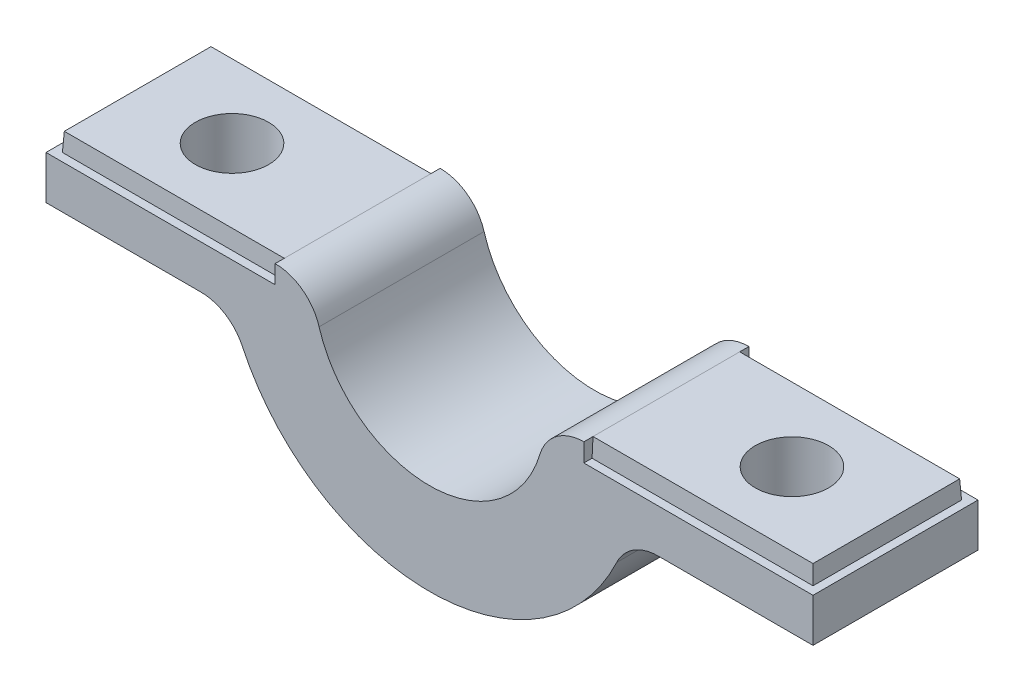
ISO-10303-21;
HEADER;
FILE_DESCRIPTION(('STEP AP214'),'2;1');
FILE_NAME('part.step','',(''),(''),'','','');
FILE_SCHEMA(('AUTOMOTIVE_DESIGN { 1 0 10303 214 1 1 1 1 }'));
ENDSEC;
DATA;
#1=APPLICATION_CONTEXT('core data for automotive mechanical design processes');
#2=APPLICATION_PROTOCOL_DEFINITION('international standard','automotive_design',2000,#1);
#3=PRODUCT_CONTEXT('',#1,'mechanical');
#4=PRODUCT('Part','Part','',(#3));
#5=PRODUCT_RELATED_PRODUCT_CATEGORY('part','',(#4));
#6=PRODUCT_DEFINITION_FORMATION('','',#4);
#7=PRODUCT_DEFINITION_CONTEXT('part definition',#1,'design');
#8=PRODUCT_DEFINITION('design','',#6,#7);
#9=PRODUCT_DEFINITION_SHAPE('','',#8);
#10=(LENGTH_UNIT() NAMED_UNIT(*) SI_UNIT(.MILLI.,.METRE.));
#11=(NAMED_UNIT(*) PLANE_ANGLE_UNIT() SI_UNIT($,.RADIAN.));
#12=(NAMED_UNIT(*) SI_UNIT($,.STERADIAN.) SOLID_ANGLE_UNIT());
#13=UNCERTAINTY_MEASURE_WITH_UNIT(LENGTH_MEASURE(1.E-05),#10,'distance_accuracy_value','');
#14=(GEOMETRIC_REPRESENTATION_CONTEXT(3) GLOBAL_UNCERTAINTY_ASSIGNED_CONTEXT((#13)) GLOBAL_UNIT_ASSIGNED_CONTEXT((#10,
#11,#12)) REPRESENTATION_CONTEXT('',''));
#15=CARTESIAN_POINT('',(0.,0.,0.));
#16=DIRECTION('',(0.,0.,1.));
#17=DIRECTION('',(1.,0.,0.));
#18=AXIS2_PLACEMENT_3D('',#15,#16,#17);
#19=CARTESIAN_POINT('',(0.,0.,0.));
#20=DIRECTION('',(0.,0.,1.));
#21=DIRECTION('',(1.,0.,0.));
#22=AXIS2_PLACEMENT_3D('',#19,#20,#21);
#23=PLANE('',#22);
#24=DIRECTION('',(0.,-1.,0.));
#25=VECTOR('',#24,1.);
#26=CARTESIAN_POINT('',(47.9639122544113,-2.,0.));
#27=LINE('',#26,#25);
#28=CARTESIAN_POINT('',(47.9639122544113,0.,0.));
#29=VERTEX_POINT('',#28);
#30=CARTESIAN_POINT('',(47.9639122544113,-2.,0.));
#31=VERTEX_POINT('',#30);
#32=EDGE_CURVE('E205',#29,#31,#27,.T.);
#33=ORIENTED_EDGE('',*,*,#32,.T.);
#34=DIRECTION('',(-1.,0.,0.));
#35=VECTOR('',#34,1.);
#36=CARTESIAN_POINT('',(-10.7127398951121,-2.,0.));
#37=LINE('',#36,#35);
#38=CARTESIAN_POINT('',(72.9639122544113,-2.,0.));
#39=VERTEX_POINT('',#38);
#40=EDGE_CURVE('E215',#39,#31,#37,.T.);
#41=ORIENTED_EDGE('',*,*,#40,.F.);
#42=DIRECTION('',(0.,-1.,0.));
#43=VECTOR('',#42,1.);
#44=CARTESIAN_POINT('',(72.9639122544113,0.,0.));
#45=LINE('',#44,#43);
#46=CARTESIAN_POINT('',(72.9639122544113,-6.73489423689242,0.));
#47=VERTEX_POINT('',#46);
#48=EDGE_CURVE('E308',#39,#47,#45,.T.);
#49=ORIENTED_EDGE('',*,*,#48,.T.);
#50=DIRECTION('',(1.,0.,0.));
#51=VECTOR('',#50,1.);
#52=CARTESIAN_POINT('',(0.,-6.73489423689242,0.));
#53=LINE('',#52,#51);
#54=CARTESIAN_POINT('',(56.0679493846258,-6.73489423689242,0.));
#55=VERTEX_POINT('',#54);
#56=EDGE_CURVE('E354',#55,#47,#53,.T.);
#57=ORIENTED_EDGE('',*,*,#56,.F.);
#58=CARTESIAN_POINT('',(56.0679493846258,-11.7348942368924,0.));
#59=DIRECTION('',(0.,0.,1.));
#60=DIRECTION('',(1.,0.,0.));
#61=AXIS2_PLACEMENT_3D('',#58,#59,#60);
#62=CIRCLE('',#61,5.);
#63=CARTESIAN_POINT('',(51.543668012419,-9.60630830602131,0.));
#64=VERTEX_POINT('',#63);
#65=EDGE_CURVE('E351',#55,#64,#62,.T.);
#66=ORIENTED_EDGE('',*,*,#65,.T.);
#67=CARTESIAN_POINT('',(31.1255861796496,0.,0.));
#68=DIRECTION('',(0.,0.,1.));
#69=DIRECTION('',(1.,0.,0.));
#70=AXIS2_PLACEMENT_3D('',#67,#68,#69);
#71=CIRCLE('',#70,22.565);
#72=CARTESIAN_POINT('',(10.7102960062231,-9.61223970439748,0.));
#73=VERTEX_POINT('',#72);
#74=EDGE_CURVE('E348',#73,#64,#71,.T.);
#75=ORIENTED_EDGE('',*,*,#74,.F.);
#76=CARTESIAN_POINT('',(6.18663321574527,-11.742139926954,0.));
#77=DIRECTION('',(0.,0.,1.));
#78=DIRECTION('',(1.,0.,0.));
#79=AXIS2_PLACEMENT_3D('',#76,#77,#78);
#80=CIRCLE('',#79,5.);
#81=CARTESIAN_POINT('',(6.18663321574527,-6.74213992695399,0.));
#82=VERTEX_POINT('',#81);
#83=EDGE_CURVE('E345',#73,#82,#80,.T.);
#84=ORIENTED_EDGE('',*,*,#83,.T.);
#85=DIRECTION('',(-1.,0.,0.));
#86=VECTOR('',#85,1.);
#87=CARTESIAN_POINT('',(0.,-6.74213992695399,0.));
#88=LINE('',#87,#86);
#89=CARTESIAN_POINT('',(-10.7127398951121,-6.74213992695399,0.));
#90=VERTEX_POINT('',#89);
#91=EDGE_CURVE('E342',#82,#90,#88,.T.);
#92=ORIENTED_EDGE('',*,*,#91,.T.);
#93=DIRECTION('',(0.,-1.,0.));
#94=VECTOR('',#93,1.);
#95=CARTESIAN_POINT('',(-10.7127398951121,0.,0.));
#96=LINE('',#95,#94);
#97=CARTESIAN_POINT('',(-10.7127398951121,-2.,0.));
#98=VERTEX_POINT('',#97);
#99=EDGE_CURVE('E340',#98,#90,#96,.T.);
#100=ORIENTED_EDGE('',*,*,#99,.F.);
#101=DIRECTION('',(-1.,0.,0.));
#102=VECTOR('',#101,1.);
#103=CARTESIAN_POINT('',(-10.7127398951121,-2.,0.));
#104=LINE('',#103,#102);
#105=CARTESIAN_POINT('',(14.2872601048879,-2.,0.));
#106=VERTEX_POINT('',#105);
#107=EDGE_CURVE('E266',#106,#98,#104,.T.);
#108=ORIENTED_EDGE('',*,*,#107,.F.);
#109=DIRECTION('',(0.,-1.,0.));
#110=VECTOR('',#109,1.);
#111=CARTESIAN_POINT('',(14.2872601048879,-2.,0.));
#112=LINE('',#111,#110);
#113=CARTESIAN_POINT('',(14.2872601048879,0.,0.));
#114=VERTEX_POINT('',#113);
#115=EDGE_CURVE('E264',#114,#106,#112,.T.);
#116=ORIENTED_EDGE('',*,*,#115,.F.);
#117=CARTESIAN_POINT('',(14.2872601048879,-5.,0.));
#118=DIRECTION('',(0.,0.,1.));
#119=DIRECTION('',(1.,0.,0.));
#120=AXIS2_PLACEMENT_3D('',#117,#118,#119);
#121=CIRCLE('',#120,5.);
#122=CARTESIAN_POINT('',(19.0804072938323,-3.57671505835468,0.));
#123=VERTEX_POINT('',#122);
#124=EDGE_CURVE('E303',#114,#123,#121,.F.);
#125=ORIENTED_EDGE('',*,*,#124,.T.);
#126=CARTESIAN_POINT('',(31.1255861796496,0.,0.));
#127=DIRECTION('',(0.,0.,1.));
#128=DIRECTION('',(1.,0.,0.));
#129=AXIS2_PLACEMENT_3D('',#126,#127,#128);
#130=CIRCLE('',#129,12.565);
#131=CARTESIAN_POINT('',(43.1707650654669,-3.57671505835468,0.));
#132=VERTEX_POINT('',#131);
#133=EDGE_CURVE('E337',#123,#132,#130,.T.);
#134=ORIENTED_EDGE('',*,*,#133,.T.);
#135=CARTESIAN_POINT('',(47.9639122544113,-5.,0.));
#136=DIRECTION('',(0.,0.,1.));
#137=DIRECTION('',(1.,0.,0.));
#138=AXIS2_PLACEMENT_3D('',#135,#136,#137);
#139=CIRCLE('',#138,5.);
#140=EDGE_CURVE('E334',#29,#132,#139,.T.);
#141=ORIENTED_EDGE('',*,*,#140,.F.);
#142=EDGE_LOOP('',(#33,#41,#49,#57,#66,#75,#84,#92,#100,#108,#116,#125,#134,#141));
#143=FACE_BOUND('',#142,.T.);
#144=ADVANCED_FACE('F41',(#143),#23,.F.);
#145=CARTESIAN_POINT('',(0.,0.,18.));
#146=DIRECTION('',(0.,0.,1.));
#147=DIRECTION('',(1.,0.,0.));
#148=AXIS2_PLACEMENT_3D('',#145,#146,#147);
#149=PLANE('',#148);
#150=DIRECTION('',(-1.,0.,0.));
#151=VECTOR('',#150,1.);
#152=CARTESIAN_POINT('',(-10.7127398951121,-2.,18.));
#153=LINE('',#152,#151);
#154=CARTESIAN_POINT('',(72.9639122544113,-2.,18.));
#155=VERTEX_POINT('',#154);
#156=CARTESIAN_POINT('',(47.9639122544113,-2.,18.));
#157=VERTEX_POINT('',#156);
#158=EDGE_CURVE('E57',#155,#157,#153,.T.);
#159=ORIENTED_EDGE('',*,*,#158,.T.);
#160=DIRECTION('',(0.,-1.,0.));
#161=VECTOR('',#160,1.);
#162=CARTESIAN_POINT('',(47.9639122544113,-2.,18.));
#163=LINE('',#162,#161);
#164=CARTESIAN_POINT('',(47.9639122544113,0.,18.));
#165=VERTEX_POINT('',#164);
#166=EDGE_CURVE('E237',#165,#157,#163,.T.);
#167=ORIENTED_EDGE('',*,*,#166,.F.);
#168=CARTESIAN_POINT('',(47.9639122544113,-5.,18.));
#169=DIRECTION('',(0.,0.,1.));
#170=DIRECTION('',(1.,0.,0.));
#171=AXIS2_PLACEMENT_3D('',#168,#169,#170);
#172=CIRCLE('',#171,5.);
#173=CARTESIAN_POINT('',(43.1707650654669,-3.57671505835468,18.));
#174=VERTEX_POINT('',#173);
#175=EDGE_CURVE('E307',#165,#174,#172,.T.);
#176=ORIENTED_EDGE('',*,*,#175,.T.);
#177=CARTESIAN_POINT('',(31.1255861796496,0.,18.));
#178=DIRECTION('',(0.,0.,1.));
#179=DIRECTION('',(1.,0.,0.));
#180=AXIS2_PLACEMENT_3D('',#177,#178,#179);
#181=CIRCLE('',#180,12.565);
#182=CARTESIAN_POINT('',(19.0804072938323,-3.57671505835468,18.));
#183=VERTEX_POINT('',#182);
#184=EDGE_CURVE('E310',#183,#174,#181,.T.);
#185=ORIENTED_EDGE('',*,*,#184,.F.);
#186=CARTESIAN_POINT('',(14.2872601048879,-5.,18.));
#187=DIRECTION('',(0.,0.,1.));
#188=DIRECTION('',(1.,0.,0.));
#189=AXIS2_PLACEMENT_3D('',#186,#187,#188);
#190=CIRCLE('',#189,5.);
#191=CARTESIAN_POINT('',(14.2872601048879,0.,18.));
#192=VERTEX_POINT('',#191);
#193=EDGE_CURVE('E304',#192,#183,#190,.F.);
#194=ORIENTED_EDGE('',*,*,#193,.F.);
#195=DIRECTION('',(0.,-1.,0.));
#196=VECTOR('',#195,1.);
#197=CARTESIAN_POINT('',(14.2872601048879,-2.,18.));
#198=LINE('',#197,#196);
#199=CARTESIAN_POINT('',(14.2872601048879,-2.,18.));
#200=VERTEX_POINT('',#199);
#201=EDGE_CURVE('E64',#192,#200,#198,.T.);
#202=ORIENTED_EDGE('',*,*,#201,.T.);
#203=DIRECTION('',(-1.,0.,0.));
#204=VECTOR('',#203,1.);
#205=CARTESIAN_POINT('',(-10.7127398951121,-2.,18.));
#206=LINE('',#205,#204);
#207=CARTESIAN_POINT('',(-10.7127398951121,-2.,18.));
#208=VERTEX_POINT('',#207);
#209=EDGE_CURVE('E260',#200,#208,#206,.T.);
#210=ORIENTED_EDGE('',*,*,#209,.T.);
#211=DIRECTION('',(0.,-1.,0.));
#212=VECTOR('',#211,1.);
#213=CARTESIAN_POINT('',(-10.7127398951121,0.,18.));
#214=LINE('',#213,#212);
#215=CARTESIAN_POINT('',(-10.7127398951121,-6.74213992695399,18.));
#216=VERTEX_POINT('',#215);
#217=EDGE_CURVE('E313',#208,#216,#214,.T.);
#218=ORIENTED_EDGE('',*,*,#217,.T.);
#219=DIRECTION('',(-1.,0.,0.));
#220=VECTOR('',#219,1.);
#221=CARTESIAN_POINT('',(0.,-6.74213992695399,18.));
#222=LINE('',#221,#220);
#223=CARTESIAN_POINT('',(6.18663321574527,-6.74213992695399,18.));
#224=VERTEX_POINT('',#223);
#225=EDGE_CURVE('E315',#224,#216,#222,.T.);
#226=ORIENTED_EDGE('',*,*,#225,.F.);
#227=CARTESIAN_POINT('',(6.18663321574527,-11.742139926954,18.));
#228=DIRECTION('',(0.,0.,1.));
#229=DIRECTION('',(1.,0.,0.));
#230=AXIS2_PLACEMENT_3D('',#227,#228,#229);
#231=CIRCLE('',#230,5.);
#232=CARTESIAN_POINT('',(10.7102960062231,-9.61223970439748,18.));
#233=VERTEX_POINT('',#232);
#234=EDGE_CURVE('E318',#233,#224,#231,.T.);
#235=ORIENTED_EDGE('',*,*,#234,.F.);
#236=CARTESIAN_POINT('',(31.1255861796496,0.,18.));
#237=DIRECTION('',(0.,0.,1.));
#238=DIRECTION('',(1.,0.,0.));
#239=AXIS2_PLACEMENT_3D('',#236,#237,#238);
#240=CIRCLE('',#239,22.565);
#241=CARTESIAN_POINT('',(51.543668012419,-9.60630830602131,18.));
#242=VERTEX_POINT('',#241);
#243=EDGE_CURVE('E321',#233,#242,#240,.T.);
#244=ORIENTED_EDGE('',*,*,#243,.T.);
#245=CARTESIAN_POINT('',(56.0679493846258,-11.7348942368924,18.));
#246=DIRECTION('',(0.,0.,1.));
#247=DIRECTION('',(1.,0.,0.));
#248=AXIS2_PLACEMENT_3D('',#245,#246,#247);
#249=CIRCLE('',#248,5.);
#250=CARTESIAN_POINT('',(56.0679493846258,-6.73489423689242,18.));
#251=VERTEX_POINT('',#250);
#252=EDGE_CURVE('E323',#251,#242,#249,.T.);
#253=ORIENTED_EDGE('',*,*,#252,.F.);
#254=DIRECTION('',(1.,0.,0.));
#255=VECTOR('',#254,1.);
#256=CARTESIAN_POINT('',(0.,-6.73489423689242,18.));
#257=LINE('',#256,#255);
#258=CARTESIAN_POINT('',(72.9639122544113,-6.73489423689242,18.));
#259=VERTEX_POINT('',#258);
#260=EDGE_CURVE('E326',#251,#259,#257,.T.);
#261=ORIENTED_EDGE('',*,*,#260,.T.);
#262=DIRECTION('',(0.,-1.,0.));
#263=VECTOR('',#262,1.);
#264=CARTESIAN_POINT('',(72.9639122544113,0.,18.));
#265=LINE('',#264,#263);
#266=EDGE_CURVE('E329',#155,#259,#265,.T.);
#267=ORIENTED_EDGE('',*,*,#266,.F.);
#268=EDGE_LOOP('',(#159,#167,#176,#185,#194,#202,#210,#218,#226,#235,#244,#253,#261,#267));
#269=FACE_BOUND('',#268,.T.);
#270=ADVANCED_FACE('F398',(#269),#149,.T.);
#271=CARTESIAN_POINT('',(-10.7127398951121,0.,-0.00999999999999959));
#272=DIRECTION('',(0.,-1.,0.));
#273=DIRECTION('',(0.,0.,-1.));
#274=AXIS2_PLACEMENT_3D('',#271,#272,#273);
#275=PLANE('',#274);
#276=CARTESIAN_POINT('',(61.6725531764272,0.,9.00473748766582));
#277=DIRECTION('',(0.,-1.,0.));
#278=DIRECTION('',(0.,0.,-1.));
#279=AXIS2_PLACEMENT_3D('',#276,#277,#278);
#280=CIRCLE('',#279,4.00000000000001);
#281=CARTESIAN_POINT('',(61.6725531764272,0.,5.0047374876658));
#282=VERTEX_POINT('',#281);
#283=EDGE_CURVE('E300',#282,#282,#280,.T.);
#284=ORIENTED_EDGE('',*,*,#283,.T.);
#285=EDGE_LOOP('',(#284));
#286=FACE_BOUND('',#285,.T.);
#287=DIRECTION('',(0.,0.,-1.));
#288=VECTOR('',#287,1.);
#289=CARTESIAN_POINT('',(71.9639122544113,0.,-0.00999999999999959));
#290=LINE('',#289,#288);
#291=CARTESIAN_POINT('',(71.9639122544113,0.,17.));
#292=VERTEX_POINT('',#291);
#293=CARTESIAN_POINT('',(71.9639122544113,0.,1.));
#294=VERTEX_POINT('',#293);
#295=EDGE_CURVE('E241',#292,#294,#290,.T.);
#296=ORIENTED_EDGE('',*,*,#295,.T.);
#297=DIRECTION('',(1.,0.,0.));
#298=VECTOR('',#297,1.);
#299=CARTESIAN_POINT('',(-10.7127398951121,0.,1.));
#300=LINE('',#299,#298);
#301=CARTESIAN_POINT('',(47.9639122544113,0.,1.));
#302=VERTEX_POINT('',#301);
#303=EDGE_CURVE('E216',#302,#294,#300,.T.);
#304=ORIENTED_EDGE('',*,*,#303,.F.);
#305=DIRECTION('',(0.,0.,-1.));
#306=VECTOR('',#305,1.);
#307=CARTESIAN_POINT('',(47.9639122544113,0.,18.));
#308=LINE('',#307,#306);
#309=CARTESIAN_POINT('',(47.9639122544113,0.,17.));
#310=VERTEX_POINT('',#309);
#311=EDGE_CURVE('E376',#310,#302,#308,.T.);
#312=ORIENTED_EDGE('',*,*,#311,.F.);
#313=DIRECTION('',(1.,0.,0.));
#314=VECTOR('',#313,1.);
#315=CARTESIAN_POINT('',(-10.7127398951121,0.,17.));
#316=LINE('',#315,#314);
#317=EDGE_CURVE('E242',#310,#292,#316,.T.);
#318=ORIENTED_EDGE('',*,*,#317,.T.);
#319=EDGE_LOOP('',(#296,#304,#312,#318));
#320=FACE_BOUND('',#319,.T.);
#321=ADVANCED_FACE('F43',(#286,#320),#275,.F.);
#322=CARTESIAN_POINT('',(0.580014645169769,0.,9.));
#323=DIRECTION('',(0.,-1.,0.));
#324=DIRECTION('',(0.,0.,-1.));
#325=AXIS2_PLACEMENT_3D('',#322,#323,#324);
#326=CIRCLE('',#325,4.);
#327=CARTESIAN_POINT('',(0.580014645169769,0.,5.));
#328=VERTEX_POINT('',#327);
#329=EDGE_CURVE('E297',#328,#328,#326,.T.);
#330=ORIENTED_EDGE('',*,*,#329,.T.);
#331=EDGE_LOOP('',(#330));
#332=FACE_BOUND('',#331,.T.);
#333=DIRECTION('',(0.,0.,-1.));
#334=VECTOR('',#333,1.);
#335=CARTESIAN_POINT('',(14.2872601048879,0.,18.));
#336=LINE('',#335,#334);
#337=CARTESIAN_POINT('',(14.2872601048879,0.,17.));
#338=VERTEX_POINT('',#337);
#339=CARTESIAN_POINT('',(14.2872601048879,0.,1.));
#340=VERTEX_POINT('',#339);
#341=EDGE_CURVE('E50',#338,#340,#336,.T.);
#342=ORIENTED_EDGE('',*,*,#341,.T.);
#343=DIRECTION('',(1.,0.,0.));
#344=VECTOR('',#343,1.);
#345=CARTESIAN_POINT('',(-10.7127398951121,0.,1.));
#346=LINE('',#345,#344);
#347=CARTESIAN_POINT('',(-9.71273989511209,0.,1.));
#348=VERTEX_POINT('',#347);
#349=EDGE_CURVE('E279',#348,#340,#346,.T.);
#350=ORIENTED_EDGE('',*,*,#349,.F.);
#351=DIRECTION('',(0.,0.,-1.));
#352=VECTOR('',#351,1.);
#353=CARTESIAN_POINT('',(-9.71273989511209,0.,-0.00999999999999959));
#354=LINE('',#353,#352);
#355=CARTESIAN_POINT('',(-9.71273989511209,0.,17.));
#356=VERTEX_POINT('',#355);
#357=EDGE_CURVE('E275',#356,#348,#354,.T.);
#358=ORIENTED_EDGE('',*,*,#357,.F.);
#359=DIRECTION('',(1.,0.,0.));
#360=VECTOR('',#359,1.);
#361=CARTESIAN_POINT('',(-10.7127398951121,0.,17.));
#362=LINE('',#361,#360);
#363=EDGE_CURVE('E263',#356,#338,#362,.T.);
#364=ORIENTED_EDGE('',*,*,#363,.T.);
#365=EDGE_LOOP('',(#342,#350,#358,#364));
#366=FACE_BOUND('',#365,.T.);
#367=ADVANCED_FACE('F412',(#332,#366),#275,.F.);
#368=CARTESIAN_POINT('',(56.0679493846258,-11.7348942368924,18.));
#369=DIRECTION('',(0.,0.,-1.));
#370=DIRECTION('',(-1.,0.,0.));
#371=AXIS2_PLACEMENT_3D('',#368,#369,#370);
#372=CYLINDRICAL_SURFACE('',#371,5.);
#373=ORIENTED_EDGE('',*,*,#65,.F.);
#374=DIRECTION('',(0.,0.,-1.));
#375=VECTOR('',#374,1.);
#376=CARTESIAN_POINT('',(56.0679493846258,-6.73489423689242,18.));
#377=LINE('',#376,#375);
#378=EDGE_CURVE('E361',#251,#55,#377,.T.);
#379=ORIENTED_EDGE('',*,*,#378,.F.);
#380=ORIENTED_EDGE('',*,*,#252,.T.);
#381=DIRECTION('',(0.,0.,-1.));
#382=VECTOR('',#381,1.);
#383=CARTESIAN_POINT('',(51.543668012419,-9.60630830602131,18.));
#384=LINE('',#383,#382);
#385=EDGE_CURVE('E364',#242,#64,#384,.T.);
#386=ORIENTED_EDGE('',*,*,#385,.T.);
#387=EDGE_LOOP('',(#373,#379,#380,#386));
#388=FACE_BOUND('',#387,.T.);
#389=ADVANCED_FACE('F419',(#388),#372,.F.);
#390=CARTESIAN_POINT('',(31.1255861796496,0.,18.));
#391=DIRECTION('',(0.,0.,-1.));
#392=DIRECTION('',(-1.,0.,0.));
#393=AXIS2_PLACEMENT_3D('',#390,#391,#392);
#394=CYLINDRICAL_SURFACE('',#393,22.565);
#395=ORIENTED_EDGE('',*,*,#74,.T.);
#396=ORIENTED_EDGE('',*,*,#385,.F.);
#397=ORIENTED_EDGE('',*,*,#243,.F.);
#398=DIRECTION('',(0.,0.,-1.));
#399=VECTOR('',#398,1.);
#400=CARTESIAN_POINT('',(10.7102960062231,-9.61223970439748,18.));
#401=LINE('',#400,#399);
#402=EDGE_CURVE('E366',#233,#73,#401,.T.);
#403=ORIENTED_EDGE('',*,*,#402,.T.);
#404=EDGE_LOOP('',(#395,#396,#397,#403));
#405=FACE_BOUND('',#404,.T.);
#406=ADVANCED_FACE('F422',(#405),#394,.T.);
#407=CARTESIAN_POINT('',(6.18663321574527,-11.742139926954,18.));
#408=DIRECTION('',(0.,0.,-1.));
#409=DIRECTION('',(-1.,0.,0.));
#410=AXIS2_PLACEMENT_3D('',#407,#408,#409);
#411=CYLINDRICAL_SURFACE('',#410,5.);
#412=ORIENTED_EDGE('',*,*,#83,.F.);
#413=ORIENTED_EDGE('',*,*,#402,.F.);
#414=ORIENTED_EDGE('',*,*,#234,.T.);
#415=DIRECTION('',(0.,0.,-1.));
#416=VECTOR('',#415,1.);
#417=CARTESIAN_POINT('',(6.18663321574527,-6.74213992695399,18.));
#418=LINE('',#417,#416);
#419=EDGE_CURVE('E368',#224,#82,#418,.T.);
#420=ORIENTED_EDGE('',*,*,#419,.T.);
#421=EDGE_LOOP('',(#412,#413,#414,#420));
#422=FACE_BOUND('',#421,.T.);
#423=ADVANCED_FACE('F417',(#422),#411,.F.);
#424=CARTESIAN_POINT('',(0.,-6.73489423689242,18.));
#425=DIRECTION('',(0.,1.,0.));
#426=DIRECTION('',(0.,0.,1.));
#427=AXIS2_PLACEMENT_3D('',#424,#425,#426);
#428=PLANE('',#427);
#429=CARTESIAN_POINT('',(61.6725531764272,-6.73489423689242,9.00473748766582));
#430=DIRECTION('',(0.,1.,0.));
#431=DIRECTION('',(0.,0.,1.));
#432=AXIS2_PLACEMENT_3D('',#429,#430,#431);
#433=CIRCLE('',#432,4.00000000000001);
#434=CARTESIAN_POINT('',(61.6725531764272,-6.73489423689242,5.0047374876658));
#435=VERTEX_POINT('',#434);
#436=EDGE_CURVE('E45',#435,#435,#433,.T.);
#437=ORIENTED_EDGE('',*,*,#436,.T.);
#438=EDGE_LOOP('',(#437));
#439=FACE_BOUND('',#438,.T.);
#440=ORIENTED_EDGE('',*,*,#56,.T.);
#441=DIRECTION('',(0.,0.,-1.));
#442=VECTOR('',#441,1.);
#443=CARTESIAN_POINT('',(72.9639122544113,-6.73489423689242,18.));
#444=LINE('',#443,#442);
#445=EDGE_CURVE('E358',#259,#47,#444,.T.);
#446=ORIENTED_EDGE('',*,*,#445,.F.);
#447=ORIENTED_EDGE('',*,*,#260,.F.);
#448=ORIENTED_EDGE('',*,*,#378,.T.);
#449=EDGE_LOOP('',(#440,#446,#447,#448));
#450=FACE_BOUND('',#449,.T.);
#451=ADVANCED_FACE('F413',(#439,#450),#428,.F.);
#452=CARTESIAN_POINT('',(31.1255861796496,0.,18.));
#453=DIRECTION('',(0.,0.,-1.));
#454=DIRECTION('',(-1.,0.,0.));
#455=AXIS2_PLACEMENT_3D('',#452,#453,#454);
#456=CYLINDRICAL_SURFACE('',#455,12.565);
#457=ORIENTED_EDGE('',*,*,#133,.F.);
#458=DIRECTION('',(0.,0.,-1.));
#459=VECTOR('',#458,1.);
#460=CARTESIAN_POINT('',(19.0804072938323,-3.57671505835468,18.));
#461=LINE('',#460,#459);
#462=EDGE_CURVE('E331',#183,#123,#461,.T.);
#463=ORIENTED_EDGE('',*,*,#462,.F.);
#464=ORIENTED_EDGE('',*,*,#184,.T.);
#465=DIRECTION('',(0.,0.,-1.));
#466=VECTOR('',#465,1.);
#467=CARTESIAN_POINT('',(43.1707650654669,-3.57671505835468,18.));
#468=LINE('',#467,#466);
#469=EDGE_CURVE('E374',#174,#132,#468,.T.);
#470=ORIENTED_EDGE('',*,*,#469,.T.);
#471=EDGE_LOOP('',(#457,#463,#464,#470));
#472=FACE_BOUND('',#471,.T.);
#473=ADVANCED_FACE('F416',(#472),#456,.F.);
#474=CARTESIAN_POINT('',(0.,-6.74213992695399,18.));
#475=DIRECTION('',(0.,-1.,0.));
#476=DIRECTION('',(0.,0.,-1.));
#477=AXIS2_PLACEMENT_3D('',#474,#475,#476);
#478=PLANE('',#477);
#479=CARTESIAN_POINT('',(0.580014645169769,-6.74213992695399,9.));
#480=DIRECTION('',(0.,-1.,0.));
#481=DIRECTION('',(0.,0.,-1.));
#482=AXIS2_PLACEMENT_3D('',#479,#480,#481);
#483=CIRCLE('',#482,4.);
#484=CARTESIAN_POINT('',(0.580014645169769,-6.74213992695399,5.));
#485=VERTEX_POINT('',#484);
#486=EDGE_CURVE('E270',#485,#485,#483,.T.);
#487=ORIENTED_EDGE('',*,*,#486,.F.);
#488=EDGE_LOOP('',(#487));
#489=FACE_BOUND('',#488,.T.);
#490=ORIENTED_EDGE('',*,*,#91,.F.);
#491=ORIENTED_EDGE('',*,*,#419,.F.);
#492=ORIENTED_EDGE('',*,*,#225,.T.);
#493=DIRECTION('',(0.,0.,-1.));
#494=VECTOR('',#493,1.);
#495=CARTESIAN_POINT('',(-10.7127398951121,-6.74213992695399,18.));
#496=LINE('',#495,#494);
#497=EDGE_CURVE('E370',#216,#90,#496,.T.);
#498=ORIENTED_EDGE('',*,*,#497,.T.);
#499=EDGE_LOOP('',(#490,#491,#492,#498));
#500=FACE_BOUND('',#499,.T.);
#501=ADVANCED_FACE('F430',(#489,#500),#478,.T.);
#502=CARTESIAN_POINT('',(-10.7127398951121,0.,18.));
#503=DIRECTION('',(1.,0.,0.));
#504=DIRECTION('',(0.,0.,-1.));
#505=AXIS2_PLACEMENT_3D('',#502,#503,#504);
#506=PLANE('',#505);
#507=ORIENTED_EDGE('',*,*,#217,.F.);
#508=DIRECTION('',(0.,0.,1.));
#509=VECTOR('',#508,1.);
#510=CARTESIAN_POINT('',(-10.7127398951121,-2.,-0.00999999999999959));
#511=LINE('',#510,#509);
#512=EDGE_CURVE('E267',#98,#208,#511,.T.);
#513=ORIENTED_EDGE('',*,*,#512,.F.);
#514=ORIENTED_EDGE('',*,*,#99,.T.);
#515=ORIENTED_EDGE('',*,*,#497,.F.);
#516=EDGE_LOOP('',(#507,#513,#514,#515));
#517=FACE_BOUND('',#516,.T.);
#518=ADVANCED_FACE('F433',(#517),#506,.F.);
#519=CARTESIAN_POINT('',(14.2872601048879,-5.,18.));
#520=DIRECTION('',(0.,0.,-1.));
#521=DIRECTION('',(-1.,0.,0.));
#522=AXIS2_PLACEMENT_3D('',#519,#520,#521);
#523=CYLINDRICAL_SURFACE('',#522,5.);
#524=ORIENTED_EDGE('',*,*,#124,.F.);
#525=DIRECTION('',(0.,0.,-1.));
#526=VECTOR('',#525,1.);
#527=CARTESIAN_POINT('',(14.2872601048879,0.,18.));
#528=LINE('',#527,#526);
#529=EDGE_CURVE('E272',#340,#114,#528,.T.);
#530=ORIENTED_EDGE('',*,*,#529,.F.);
#531=ORIENTED_EDGE('',*,*,#341,.F.);
#532=EDGE_CURVE('E12',#192,#338,#336,.T.);
#533=ORIENTED_EDGE('',*,*,#532,.F.);
#534=ORIENTED_EDGE('',*,*,#193,.T.);
#535=ORIENTED_EDGE('',*,*,#462,.T.);
#536=EDGE_LOOP('',(#524,#530,#531,#533,#534,#535));
#537=FACE_BOUND('',#536,.T.);
#538=ADVANCED_FACE('F437',(#537),#523,.T.);
#539=CARTESIAN_POINT('',(47.9639122544113,-5.,18.));
#540=DIRECTION('',(0.,0.,-1.));
#541=DIRECTION('',(-1.,0.,0.));
#542=AXIS2_PLACEMENT_3D('',#539,#540,#541);
#543=CYLINDRICAL_SURFACE('',#542,5.);
#544=ORIENTED_EDGE('',*,*,#140,.T.);
#545=ORIENTED_EDGE('',*,*,#469,.F.);
#546=ORIENTED_EDGE('',*,*,#175,.F.);
#547=EDGE_CURVE('E362',#165,#310,#308,.T.);
#548=ORIENTED_EDGE('',*,*,#547,.T.);
#549=ORIENTED_EDGE('',*,*,#311,.T.);
#550=DIRECTION('',(0.,0.,-1.));
#551=VECTOR('',#550,1.);
#552=CARTESIAN_POINT('',(47.9639122544113,0.,18.));
#553=LINE('',#552,#551);
#554=EDGE_CURVE('E200',#302,#29,#553,.T.);
#555=ORIENTED_EDGE('',*,*,#554,.T.);
#556=EDGE_LOOP('',(#544,#545,#546,#548,#549,#555));
#557=FACE_BOUND('',#556,.T.);
#558=ADVANCED_FACE('F381',(#557),#543,.T.);
#559=CARTESIAN_POINT('',(72.9639122544113,0.,18.));
#560=DIRECTION('',(1.,0.,0.));
#561=DIRECTION('',(0.,0.,-1.));
#562=AXIS2_PLACEMENT_3D('',#559,#560,#561);
#563=PLANE('',#562);
#564=DIRECTION('',(0.,0.,1.));
#565=VECTOR('',#564,1.);
#566=CARTESIAN_POINT('',(72.9639122544113,-2.,-0.00999999999999959));
#567=LINE('',#566,#565);
#568=EDGE_CURVE('E229',#39,#155,#567,.T.);
#569=ORIENTED_EDGE('',*,*,#568,.T.);
#570=ORIENTED_EDGE('',*,*,#266,.T.);
#571=ORIENTED_EDGE('',*,*,#445,.T.);
#572=ORIENTED_EDGE('',*,*,#48,.F.);
#573=EDGE_LOOP('',(#569,#570,#571,#572));
#574=FACE_BOUND('',#573,.T.);
#575=ADVANCED_FACE('F407',(#574),#563,.T.);
#576=CARTESIAN_POINT('',(0.580014645169769,38.257860073046,9.));
#577=DIRECTION('',(0.,-1.,0.));
#578=DIRECTION('',(0.,0.,-1.));
#579=AXIS2_PLACEMENT_3D('',#576,#577,#578);
#580=CYLINDRICAL_SURFACE('',#579,4.);
#581=CARTESIAN_POINT('',(0.580014645169769,-6.74213992695399,5.));
#582=CARTESIAN_POINT('',(0.580014645169769,-6.67190930271488,5.));
#583=CARTESIAN_POINT('',(0.580014645169769,-6.60167867847578,5.));
#584=CARTESIAN_POINT('',(0.580014645169769,-6.46121742999757,5.));
#585=CARTESIAN_POINT('',(0.580014645169769,-6.39098680575846,5.));
#586=CARTESIAN_POINT('',(0.580014645169769,-6.25052555728026,5.));
#587=CARTESIAN_POINT('',(0.580014645169769,-6.18029493304115,5.));
#588=CARTESIAN_POINT('',(0.580014645169769,-6.03983368456295,5.));
#589=CARTESIAN_POINT('',(0.580014645169769,-5.96960306032384,5.));
#590=CARTESIAN_POINT('',(0.580014645169769,-5.82914181184563,5.));
#591=CARTESIAN_POINT('',(0.580014645169769,-5.75891118760653,5.));
#592=CARTESIAN_POINT('',(0.580014645169769,-5.61844993912832,5.));
#593=CARTESIAN_POINT('',(0.580014645169769,-5.54821931488922,5.));
#594=CARTESIAN_POINT('',(0.580014645169769,-5.40775806641101,5.));
#595=CARTESIAN_POINT('',(0.580014645169769,-5.33752744217191,5.));
#596=CARTESIAN_POINT('',(0.580014645169769,-5.1970661936937,5.));
#597=CARTESIAN_POINT('',(0.580014645169769,-5.12683556945459,5.));
#598=CARTESIAN_POINT('',(0.580014645169769,-4.98637432097638,5.));
#599=CARTESIAN_POINT('',(0.580014645169769,-4.91614369673728,5.));
#600=CARTESIAN_POINT('',(0.580014645169769,-4.77568244825907,5.));
#601=CARTESIAN_POINT('',(0.580014645169769,-4.70545182401997,5.));
#602=CARTESIAN_POINT('',(0.580014645169769,-4.56499057554176,5.));
#603=CARTESIAN_POINT('',(0.580014645169769,-4.49475995130266,5.));
#604=CARTESIAN_POINT('',(0.580014645169769,-4.35429870282445,5.));
#605=CARTESIAN_POINT('',(0.580014645169769,-4.28406807858534,5.));
#606=CARTESIAN_POINT('',(0.580014645169769,-4.14360683010713,5.));
#607=CARTESIAN_POINT('',(0.580014645169769,-4.07337620586803,5.));
#608=CARTESIAN_POINT('',(0.580014645169769,-3.93291495738982,5.));
#609=CARTESIAN_POINT('',(0.580014645169769,-3.86268433315072,5.));
#610=CARTESIAN_POINT('',(0.580014645169769,-3.72222308467251,5.));
#611=CARTESIAN_POINT('',(0.580014645169769,-3.65199246043341,5.));
#612=CARTESIAN_POINT('',(0.580014645169769,-3.5115312119552,5.));
#613=CARTESIAN_POINT('',(0.580014645169769,-3.44130058771609,5.));
#614=CARTESIAN_POINT('',(0.580014645169769,-3.30083933923789,5.));
#615=CARTESIAN_POINT('',(0.580014645169769,-3.23060871499878,5.));
#616=CARTESIAN_POINT('',(0.580014645169769,-3.09014746652057,5.));
#617=CARTESIAN_POINT('',(0.580014645169769,-3.01991684228147,5.));
#618=CARTESIAN_POINT('',(0.580014645169769,-2.87945559380326,5.));
#619=CARTESIAN_POINT('',(0.580014645169769,-2.80922496956416,5.));
#620=CARTESIAN_POINT('',(0.580014645169769,-2.66876372108595,5.));
#621=CARTESIAN_POINT('',(0.580014645169769,-2.59853309684685,5.));
#622=CARTESIAN_POINT('',(0.580014645169769,-2.45807184836864,5.));
#623=CARTESIAN_POINT('',(0.580014645169769,-2.38784122412953,5.));
#624=CARTESIAN_POINT('',(0.580014645169769,-2.24737997565132,5.));
#625=CARTESIAN_POINT('',(0.580014645169769,-2.17714935141222,5.));
#626=CARTESIAN_POINT('',(0.580014645169769,-2.03668810293401,5.));
#627=CARTESIAN_POINT('',(0.580014645169769,-1.96645747869491,5.));
#628=CARTESIAN_POINT('',(0.580014645169769,-1.8259962302167,5.));
#629=CARTESIAN_POINT('',(0.580014645169769,-1.7557656059776,5.));
#630=CARTESIAN_POINT('',(0.580014645169769,-1.61530435749939,5.));
#631=CARTESIAN_POINT('',(0.580014645169769,-1.54507373326028,5.));
#632=CARTESIAN_POINT('',(0.580014645169769,-1.40461248478207,5.));
#633=CARTESIAN_POINT('',(0.580014645169769,-1.33438186054297,5.));
#634=CARTESIAN_POINT('',(0.580014645169769,-1.19392061206476,5.));
#635=CARTESIAN_POINT('',(0.580014645169769,-1.12368998782566,5.));
#636=CARTESIAN_POINT('',(0.580014645169769,-0.983228739347452,5.));
#637=CARTESIAN_POINT('',(0.580014645169769,-0.912998115108347,5.));
#638=CARTESIAN_POINT('',(0.580014645169769,-0.772536866630138,5.));
#639=CARTESIAN_POINT('',(0.580014645169769,-0.702306242391033,5.));
#640=CARTESIAN_POINT('',(0.580014645169769,-0.561844993912826,5.));
#641=CARTESIAN_POINT('',(0.580014645169769,-0.491614369673724,5.));
#642=CARTESIAN_POINT('',(0.580014645169769,-0.351153121195517,5.));
#643=CARTESIAN_POINT('',(0.580014645169769,-0.280922496956412,5.));
#644=CARTESIAN_POINT('',(0.580014645169769,-0.140461248478202,5.));
#645=CARTESIAN_POINT('',(0.580014645169769,-0.0702306242390977,5.));
#646=CARTESIAN_POINT('',(0.580014645169769,0.,5.));
#647=B_SPLINE_CURVE_WITH_KNOTS('',3,(#581,#582,#583,#584,#585,#586,#587,#588,#589,#590,#591,
#592,#593,#594,#595,#596,#597,#598,#599,#600,#601,#602,#603,#604,#605,#606,#607,#608,#609,#610,
#611,#612,#613,#614,#615,#616,#617,#618,#619,#620,#621,#622,#623,#624,#625,#626,#627,#628,#629,
#630,#631,#632,#633,#634,#635,#636,#637,#638,#639,#640,#641,#642,#643,#644,#645,#646),
.UNSPECIFIED.,.F.,.F.,(4,2,2,2,2,2,2,2,2,2,2,2,2,2,2,2,2,2,2,2,2,2,2,2,2,2,2,2,2,2,2,2,4),(0.,
0.210691872717314,0.421383745434628,0.632075618151935,0.842767490869249,1.05345936358656,
1.26415123630387,1.47484310902118,1.6855349817385,1.89622685445581,2.10691872717313,
2.31761059989043,2.52830247260775,2.73899434532506,2.94968621804237,3.16037809075968,
3.371069963477,3.58176183619431,3.79245370891163,4.00314558162893,4.21383745434625,
4.42452932706356,4.63522119978087,4.84591307249818,5.0566049452155,5.26729681793281,
5.47798869065012,5.68868056336743,5.89937243608474,6.11006430880206,6.32075618151937,
6.53144805423668,6.74213992695399),.UNSPECIFIED.);
#648=EDGE_CURVE('BSEAM410',#485,#328,#647,.T.);
#649=ORIENTED_EDGE('',*,*,#486,.T.);
#650=ORIENTED_EDGE('',*,*,#329,.F.);
#651=ORIENTED_EDGE('',*,*,#648,.T.);
#652=ORIENTED_EDGE('',*,*,#648,.F.);
#653=EDGE_LOOP('',(#649,#651,#650,#652));
#654=FACE_BOUND('',#653,.T.);
#655=ADVANCED_FACE('F410',(#654),#580,.F.);
#656=CARTESIAN_POINT('',(61.6725531764272,38.257860073046,9.00473748766582));
#657=DIRECTION('',(0.,-1.,0.));
#658=DIRECTION('',(0.,0.,-1.));
#659=AXIS2_PLACEMENT_3D('',#656,#657,#658);
#660=CYLINDRICAL_SURFACE('',#659,4.00000000000001);
#661=CARTESIAN_POINT('',(61.6725531764272,-6.73489423689242,5.0047374876658));
#662=CARTESIAN_POINT('',(61.6725531764272,-6.66473908859146,5.0047374876658));
#663=CARTESIAN_POINT('',(61.6725531764272,-6.5945839402905,5.0047374876658));
#664=CARTESIAN_POINT('',(61.6725531764272,-6.45427364368857,5.0047374876658));
#665=CARTESIAN_POINT('',(61.6725531764272,-6.38411849538761,5.0047374876658));
#666=CARTESIAN_POINT('',(61.6725531764272,-6.24380819878568,5.0047374876658));
#667=CARTESIAN_POINT('',(61.6725531764272,-6.17365305048472,5.0047374876658));
#668=CARTESIAN_POINT('',(61.6725531764272,-6.03334275388279,5.0047374876658));
#669=CARTESIAN_POINT('',(61.6725531764272,-5.96318760558183,5.0047374876658));
#670=CARTESIAN_POINT('',(61.6725531764272,-5.8228773089799,5.0047374876658));
#671=CARTESIAN_POINT('',(61.6725531764272,-5.75272216067894,5.0047374876658));
#672=CARTESIAN_POINT('',(61.6725531764272,-5.61241186407702,5.0047374876658));
#673=CARTESIAN_POINT('',(61.6725531764272,-5.54225671577605,5.0047374876658));
#674=CARTESIAN_POINT('',(61.6725531764272,-5.40194641917413,5.0047374876658));
#675=CARTESIAN_POINT('',(61.6725531764272,-5.33179127087316,5.0047374876658));
#676=CARTESIAN_POINT('',(61.6725531764272,-5.19148097427124,5.0047374876658));
#677=CARTESIAN_POINT('',(61.6725531764272,-5.12132582597027,5.0047374876658));
#678=CARTESIAN_POINT('',(61.6725531764272,-4.98101552936835,5.0047374876658));
#679=CARTESIAN_POINT('',(61.6725531764272,-4.91086038106739,5.0047374876658));
#680=CARTESIAN_POINT('',(61.6725531764272,-4.77055008446546,5.0047374876658));
#681=CARTESIAN_POINT('',(61.6725531764272,-4.7003949361645,5.0047374876658));
#682=CARTESIAN_POINT('',(61.6725531764272,-4.56008463956258,5.0047374876658));
#683=CARTESIAN_POINT('',(61.6725531764272,-4.48992949126161,5.0047374876658));
#684=CARTESIAN_POINT('',(61.6725531764272,-4.34961919465969,5.0047374876658));
#685=CARTESIAN_POINT('',(61.6725531764272,-4.27946404635872,5.0047374876658));
#686=CARTESIAN_POINT('',(61.6725531764272,-4.1391537497568,5.0047374876658));
#687=CARTESIAN_POINT('',(61.6725531764272,-4.06899860145583,5.0047374876658));
#688=CARTESIAN_POINT('',(61.6725531764272,-3.92868830485391,5.0047374876658));
#689=CARTESIAN_POINT('',(61.6725531764272,-3.85853315655295,5.0047374876658));
#690=CARTESIAN_POINT('',(61.6725531764272,-3.71822285995102,5.0047374876658));
#691=CARTESIAN_POINT('',(61.6725531764272,-3.64806771165006,5.0047374876658));
#692=CARTESIAN_POINT('',(61.6725531764272,-3.50775741504813,5.0047374876658));
#693=CARTESIAN_POINT('',(61.6725531764272,-3.43760226674717,5.0047374876658));
#694=CARTESIAN_POINT('',(61.6725531764272,-3.29729197014524,5.0047374876658));
#695=CARTESIAN_POINT('',(61.6725531764272,-3.22713682184428,5.0047374876658));
#696=CARTESIAN_POINT('',(61.6725531764272,-3.08682652524236,5.0047374876658));
#697=CARTESIAN_POINT('',(61.6725531764272,-3.01667137694139,5.0047374876658));
#698=CARTESIAN_POINT('',(61.6725531764272,-2.87636108033947,5.0047374876658));
#699=CARTESIAN_POINT('',(61.6725531764272,-2.80620593203851,5.0047374876658));
#700=CARTESIAN_POINT('',(61.6725531764272,-2.66589563543658,5.0047374876658));
#701=CARTESIAN_POINT('',(61.6725531764272,-2.59574048713562,5.0047374876658));
#702=CARTESIAN_POINT('',(61.6725531764272,-2.45543019053369,5.0047374876658));
#703=CARTESIAN_POINT('',(61.6725531764272,-2.38527504223273,5.0047374876658));
#704=CARTESIAN_POINT('',(61.6725531764272,-2.2449647456308,5.0047374876658));
#705=CARTESIAN_POINT('',(61.6725531764272,-2.17480959732984,5.0047374876658));
#706=CARTESIAN_POINT('',(61.6725531764272,-2.03449930072791,5.0047374876658));
#707=CARTESIAN_POINT('',(61.6725531764272,-1.96434415242695,5.0047374876658));
#708=CARTESIAN_POINT('',(61.6725531764272,-1.82403385582503,5.0047374876658));
#709=CARTESIAN_POINT('',(61.6725531764272,-1.75387870752407,5.0047374876658));
#710=CARTESIAN_POINT('',(61.6725531764272,-1.61356841092214,5.0047374876658));
#711=CARTESIAN_POINT('',(61.6725531764272,-1.54341326262118,5.0047374876658));
#712=CARTESIAN_POINT('',(61.6725531764272,-1.40310296601925,5.0047374876658));
#713=CARTESIAN_POINT('',(61.6725531764272,-1.33294781771829,5.0047374876658));
#714=CARTESIAN_POINT('',(61.6725531764272,-1.19263752111636,5.0047374876658));
#715=CARTESIAN_POINT('',(61.6725531764272,-1.1224823728154,5.0047374876658));
#716=CARTESIAN_POINT('',(61.6725531764272,-0.982172076213472,5.0047374876658));
#717=CARTESIAN_POINT('',(61.6725531764272,-0.91201692791251,5.0047374876658));
#718=CARTESIAN_POINT('',(61.6725531764272,-0.771706631310584,5.0047374876658));
#719=CARTESIAN_POINT('',(61.6725531764272,-0.70155148300962,5.0047374876658));
#720=CARTESIAN_POINT('',(61.6725531764272,-0.561241186407694,5.0047374876658));
#721=CARTESIAN_POINT('',(61.6725531764272,-0.491086038106732,5.0047374876658));
#722=CARTESIAN_POINT('',(61.6725531764272,-0.350775741504807,5.0047374876658));
#723=CARTESIAN_POINT('',(61.6725531764272,-0.280620593203842,5.0047374876658));
#724=CARTESIAN_POINT('',(61.6725531764272,-0.140310296601917,5.0047374876658));
#725=CARTESIAN_POINT('',(61.6725531764272,-0.0701551483009549,5.0047374876658));
#726=CARTESIAN_POINT('',(61.6725531764272,0.,5.0047374876658));
#727=B_SPLINE_CURVE_WITH_KNOTS('',3,(#661,#662,#663,#664,#665,#666,#667,#668,#669,#670,#671,
#672,#673,#674,#675,#676,#677,#678,#679,#680,#681,#682,#683,#684,#685,#686,#687,#688,#689,#690,
#691,#692,#693,#694,#695,#696,#697,#698,#699,#700,#701,#702,#703,#704,#705,#706,#707,#708,#709,
#710,#711,#712,#713,#714,#715,#716,#717,#718,#719,#720,#721,#722,#723,#724,#725,#726),
.UNSPECIFIED.,.F.,.F.,(4,2,2,2,2,2,2,2,2,2,2,2,2,2,2,2,2,2,2,2,2,2,2,2,2,2,2,2,2,2,2,2,4),(0.,
0.210465444902885,0.420930889805778,0.631396334708663,0.841861779611555,1.05232722451444,
1.26279266941733,1.47325811432022,1.68372355922311,1.894189004126,2.10465444902888,
2.31511989393177,2.52558533883466,2.73605078373755,2.94651622864044,3.15698167354333,
3.36744711844621,3.5779125633491,3.78837800825199,3.99884345315488,4.20930889805777,
4.41977434296065,4.63023978786355,4.84070523276643,5.05117067766932,5.26163612257221,
5.47210156747509,5.68256701237799,5.89303245728087,6.10349790218376,6.31396334708665,
6.52442879198954,6.73489423689243),.UNSPECIFIED.);
#728=EDGE_CURVE('BSEAM508',#435,#282,#727,.T.);
#729=ORIENTED_EDGE('',*,*,#436,.F.);
#730=ORIENTED_EDGE('',*,*,#283,.F.);
#731=ORIENTED_EDGE('',*,*,#728,.T.);
#732=ORIENTED_EDGE('',*,*,#728,.F.);
#733=EDGE_LOOP('',(#729,#731,#730,#732));
#734=FACE_BOUND('',#733,.T.);
#735=ADVANCED_FACE('F508',(#734),#660,.F.);
#736=CARTESIAN_POINT('',(14.2872601048879,-2.,18.));
#737=DIRECTION('',(1.,0.,0.));
#738=DIRECTION('',(0.,0.,-1.));
#739=AXIS2_PLACEMENT_3D('',#736,#737,#738);
#740=PLANE('',#739);
#741=ORIENTED_EDGE('',*,*,#532,.T.);
#742=DIRECTION('',(0.,-0.998629534754574,0.0523359562429438));
#743=VECTOR('',#742,1.);
#744=CARTESIAN_POINT('',(14.2872601048879,0.,17.));
#745=LINE('',#744,#743);
#746=CARTESIAN_POINT('',(14.2872601048879,-2.,17.1048155585661));
#747=VERTEX_POINT('',#746);
#748=EDGE_CURVE('E253',#747,#338,#745,.F.);
#749=ORIENTED_EDGE('',*,*,#748,.F.);
#750=DIRECTION('',(0.,0.,-1.));
#751=VECTOR('',#750,1.);
#752=CARTESIAN_POINT('',(14.2872601048879,-2.,18.));
#753=LINE('',#752,#751);
#754=EDGE_CURVE('E256',#200,#747,#753,.T.);
#755=ORIENTED_EDGE('',*,*,#754,.F.);
#756=ORIENTED_EDGE('',*,*,#201,.F.);
#757=EDGE_LOOP('',(#741,#749,#755,#756));
#758=FACE_BOUND('',#757,.T.);
#759=ADVANCED_FACE('F480',(#758),#740,.F.);
#760=CARTESIAN_POINT('',(-9.71273989511209,0.,-0.00999999999999959));
#761=DIRECTION('',(0.998629534754574,-0.0523359562429438,0.));
#762=DIRECTION('',(0.0523359562429438,0.998629534754574,0.));
#763=AXIS2_PLACEMENT_3D('',#760,#761,#762);
#764=PLANE('',#763);
#765=ORIENTED_EDGE('',*,*,#357,.T.);
#766=DIRECTION('',(0.0522644276887139,0.997264688634237,0.0522644276887139));
#767=VECTOR('',#766,1.);
#768=CARTESIAN_POINT('',(-9.71547146551372,-0.0521214682056319,0.997268429598371));
#769=LINE('',#768,#767);
#770=CARTESIAN_POINT('',(-9.81755545367817,-2.,0.895184441433918));
#771=VERTEX_POINT('',#770);
#772=EDGE_CURVE('E288',#771,#348,#769,.T.);
#773=ORIENTED_EDGE('',*,*,#772,.F.);
#774=DIRECTION('',(0.,0.,-1.));
#775=VECTOR('',#774,1.);
#776=CARTESIAN_POINT('',(-9.81755545367817,-2.,-0.00999999999999959));
#777=LINE('',#776,#775);
#778=CARTESIAN_POINT('',(-9.81755545367817,-2.,17.1048155585661));
#779=VERTEX_POINT('',#778);
#780=EDGE_CURVE('E255',#779,#771,#777,.T.);
#781=ORIENTED_EDGE('',*,*,#780,.F.);
#782=DIRECTION('',(-0.0522644276887139,-0.997264688634237,0.0522644276887139));
#783=VECTOR('',#782,1.);
#784=CARTESIAN_POINT('',(-9.71547146551372,-0.0521214682056319,17.0027315704016));
#785=LINE('',#784,#783);
#786=EDGE_CURVE('E261',#779,#356,#785,.F.);
#787=ORIENTED_EDGE('',*,*,#786,.T.);
#788=EDGE_LOOP('',(#765,#773,#781,#787));
#789=FACE_BOUND('',#788,.T.);
#790=ADVANCED_FACE('F490',(#789),#764,.F.);
#791=CARTESIAN_POINT('',(-10.7127398951121,0.,1.));
#792=DIRECTION('',(0.,-0.0523359562429438,0.998629534754574));
#793=DIRECTION('',(0.,-0.998629534754574,-0.0523359562429438));
#794=AXIS2_PLACEMENT_3D('',#791,#792,#793);
#795=PLANE('',#794);
#796=ORIENTED_EDGE('',*,*,#349,.T.);
#797=DIRECTION('',(0.,0.998629534754574,0.0523359562429438));
#798=VECTOR('',#797,1.);
#799=CARTESIAN_POINT('',(14.2872601048879,0.,1.));
#800=LINE('',#799,#798);
#801=CARTESIAN_POINT('',(14.2872601048879,-2.,0.895184441433921));
#802=VERTEX_POINT('',#801);
#803=EDGE_CURVE('E292',#802,#340,#800,.T.);
#804=ORIENTED_EDGE('',*,*,#803,.F.);
#805=DIRECTION('',(1.,0.,0.));
#806=VECTOR('',#805,1.);
#807=CARTESIAN_POINT('',(-10.7127398951121,-2.,0.895184441433918));
#808=LINE('',#807,#806);
#809=EDGE_CURVE('E289',#771,#802,#808,.T.);
#810=ORIENTED_EDGE('',*,*,#809,.F.);
#811=ORIENTED_EDGE('',*,*,#772,.T.);
#812=EDGE_LOOP('',(#796,#804,#810,#811));
#813=FACE_BOUND('',#812,.T.);
#814=ADVANCED_FACE('F493',(#813),#795,.F.);
#815=ORIENTED_EDGE('',*,*,#115,.T.);
#816=EDGE_CURVE('E277',#802,#106,#753,.T.);
#817=ORIENTED_EDGE('',*,*,#816,.F.);
#818=ORIENTED_EDGE('',*,*,#803,.T.);
#819=ORIENTED_EDGE('',*,*,#529,.T.);
#820=EDGE_LOOP('',(#815,#817,#818,#819));
#821=FACE_BOUND('',#820,.T.);
#822=ADVANCED_FACE('F496',(#821),#740,.F.);
#823=CARTESIAN_POINT('',(-10.7127398951121,0.,17.));
#824=DIRECTION('',(0.,-0.0523359562429438,-0.998629534754574));
#825=DIRECTION('',(0.,0.998629534754574,-0.0523359562429438));
#826=AXIS2_PLACEMENT_3D('',#823,#824,#825);
#827=PLANE('',#826);
#828=ORIENTED_EDGE('',*,*,#363,.F.);
#829=ORIENTED_EDGE('',*,*,#786,.F.);
#830=DIRECTION('',(-1.,0.,0.));
#831=VECTOR('',#830,1.);
#832=CARTESIAN_POINT('',(-10.7127398951121,-2.,17.1048155585661));
#833=LINE('',#832,#831);
#834=EDGE_CURVE('E257',#779,#747,#833,.F.);
#835=ORIENTED_EDGE('',*,*,#834,.T.);
#836=ORIENTED_EDGE('',*,*,#748,.T.);
#837=EDGE_LOOP('',(#828,#829,#835,#836));
#838=FACE_BOUND('',#837,.T.);
#839=ADVANCED_FACE('F486',(#838),#827,.F.);
#840=CARTESIAN_POINT('',(-10.7127398951121,-2.,-0.00999999999999959));
#841=DIRECTION('',(0.,-1.,0.));
#842=DIRECTION('',(0.,0.,-1.));
#843=AXIS2_PLACEMENT_3D('',#840,#841,#842);
#844=PLANE('',#843);
#845=ORIENTED_EDGE('',*,*,#107,.T.);
#846=ORIENTED_EDGE('',*,*,#512,.T.);
#847=ORIENTED_EDGE('',*,*,#209,.F.);
#848=ORIENTED_EDGE('',*,*,#754,.T.);
#849=ORIENTED_EDGE('',*,*,#834,.F.);
#850=ORIENTED_EDGE('',*,*,#780,.T.);
#851=ORIENTED_EDGE('',*,*,#809,.T.);
#852=ORIENTED_EDGE('',*,*,#816,.T.);
#853=EDGE_LOOP('',(#845,#846,#847,#848,#849,#850,#851,#852));
#854=FACE_BOUND('',#853,.T.);
#855=ADVANCED_FACE('F476',(#854),#844,.F.);
#856=CARTESIAN_POINT('',(47.9639122544113,-2.,18.));
#857=DIRECTION('',(1.,0.,0.));
#858=DIRECTION('',(0.,0.,-1.));
#859=AXIS2_PLACEMENT_3D('',#856,#857,#858);
#860=PLANE('',#859);
#861=ORIENTED_EDGE('',*,*,#166,.T.);
#862=DIRECTION('',(0.,0.,-1.));
#863=VECTOR('',#862,1.);
#864=CARTESIAN_POINT('',(47.9639122544113,-2.,18.));
#865=LINE('',#864,#863);
#866=CARTESIAN_POINT('',(47.9639122544113,-2.,17.1048155585661));
#867=VERTEX_POINT('',#866);
#868=EDGE_CURVE('E219',#157,#867,#865,.T.);
#869=ORIENTED_EDGE('',*,*,#868,.T.);
#870=DIRECTION('',(0.,-0.998629534754574,0.0523359562429438));
#871=VECTOR('',#870,1.);
#872=CARTESIAN_POINT('',(47.9639122544113,0.,17.));
#873=LINE('',#872,#871);
#874=EDGE_CURVE('E233',#867,#310,#873,.F.);
#875=ORIENTED_EDGE('',*,*,#874,.T.);
#876=ORIENTED_EDGE('',*,*,#547,.F.);
#877=EDGE_LOOP('',(#861,#869,#875,#876));
#878=FACE_BOUND('',#877,.T.);
#879=ADVANCED_FACE('F637',(#878),#860,.T.);
#880=ORIENTED_EDGE('',*,*,#554,.F.);
#881=DIRECTION('',(0.,0.998629534754574,0.0523359562429438));
#882=VECTOR('',#881,1.);
#883=CARTESIAN_POINT('',(47.9639122544113,0.,1.));
#884=LINE('',#883,#882);
#885=CARTESIAN_POINT('',(47.9639122544113,-2.,0.895184441433921));
#886=VERTEX_POINT('',#885);
#887=EDGE_CURVE('E193',#886,#302,#884,.T.);
#888=ORIENTED_EDGE('',*,*,#887,.F.);
#889=EDGE_CURVE('E197',#886,#31,#865,.T.);
#890=ORIENTED_EDGE('',*,*,#889,.T.);
#891=ORIENTED_EDGE('',*,*,#32,.F.);
#892=EDGE_LOOP('',(#880,#888,#890,#891));
#893=FACE_BOUND('',#892,.T.);
#894=ADVANCED_FACE('F195',(#893),#860,.T.);
#895=CARTESIAN_POINT('',(-10.7127398951121,0.,1.));
#896=DIRECTION('',(0.,-0.0523359562429438,0.998629534754574));
#897=DIRECTION('',(0.,-0.998629534754574,-0.0523359562429438));
#898=AXIS2_PLACEMENT_3D('',#895,#896,#897);
#899=PLANE('',#898);
#900=ORIENTED_EDGE('',*,*,#303,.T.);
#901=DIRECTION('',(0.0522644276887139,-0.997264688634237,-0.0522644276887139));
#902=VECTOR('',#901,1.);
#903=CARTESIAN_POINT('',(71.7380751584939,4.30922849635947,1.2258370959174));
#904=LINE('',#903,#902);
#905=CARTESIAN_POINT('',(72.0687278129774,-2.,0.895184441433918));
#906=VERTEX_POINT('',#905);
#907=EDGE_CURVE('E209',#906,#294,#904,.F.);
#908=ORIENTED_EDGE('',*,*,#907,.F.);
#909=DIRECTION('',(1.,0.,0.));
#910=VECTOR('',#909,1.);
#911=CARTESIAN_POINT('',(-10.7127398951121,-2.,0.895184441433918));
#912=LINE('',#911,#910);
#913=EDGE_CURVE('E204',#886,#906,#912,.T.);
#914=ORIENTED_EDGE('',*,*,#913,.F.);
#915=ORIENTED_EDGE('',*,*,#887,.T.);
#916=EDGE_LOOP('',(#900,#908,#914,#915));
#917=FACE_BOUND('',#916,.T.);
#918=ADVANCED_FACE('F208',(#917),#899,.F.);
#919=CARTESIAN_POINT('',(71.9639122544113,0.,-0.00999999999999959));
#920=DIRECTION('',(-0.998629534754574,-0.0523359562429438,0.));
#921=DIRECTION('',(0.0523359562429438,-0.998629534754574,0.));
#922=AXIS2_PLACEMENT_3D('',#919,#920,#921);
#923=PLANE('',#922);
#924=ORIENTED_EDGE('',*,*,#295,.F.);
#925=DIRECTION('',(-0.0522644276887139,0.997264688634237,-0.0522644276887139));
#926=VECTOR('',#925,1.);
#927=CARTESIAN_POINT('',(71.7380751584939,4.30922849635947,16.7741629040826));
#928=LINE('',#927,#926);
#929=CARTESIAN_POINT('',(72.0687278129774,-2.,17.1048155585661));
#930=VERTEX_POINT('',#929);
#931=EDGE_CURVE('E245',#930,#292,#928,.T.);
#932=ORIENTED_EDGE('',*,*,#931,.F.);
#933=DIRECTION('',(0.,0.,1.));
#934=VECTOR('',#933,1.);
#935=CARTESIAN_POINT('',(72.0687278129774,-2.,-0.00999999999999959));
#936=LINE('',#935,#934);
#937=EDGE_CURVE('E217',#930,#906,#936,.F.);
#938=ORIENTED_EDGE('',*,*,#937,.T.);
#939=ORIENTED_EDGE('',*,*,#907,.T.);
#940=EDGE_LOOP('',(#924,#932,#938,#939));
#941=FACE_BOUND('',#940,.T.);
#942=ADVANCED_FACE('F385',(#941),#923,.F.);
#943=CARTESIAN_POINT('',(-10.7127398951121,0.,17.));
#944=DIRECTION('',(0.,-0.0523359562429438,-0.998629534754574));
#945=DIRECTION('',(0.,0.998629534754574,-0.0523359562429438));
#946=AXIS2_PLACEMENT_3D('',#943,#944,#945);
#947=PLANE('',#946);
#948=ORIENTED_EDGE('',*,*,#317,.F.);
#949=ORIENTED_EDGE('',*,*,#874,.F.);
#950=DIRECTION('',(-1.,0.,0.));
#951=VECTOR('',#950,1.);
#952=CARTESIAN_POINT('',(-10.7127398951121,-2.,17.1048155585661));
#953=LINE('',#952,#951);
#954=EDGE_CURVE('E221',#867,#930,#953,.F.);
#955=ORIENTED_EDGE('',*,*,#954,.T.);
#956=ORIENTED_EDGE('',*,*,#931,.T.);
#957=EDGE_LOOP('',(#948,#949,#955,#956));
#958=FACE_BOUND('',#957,.T.);
#959=ADVANCED_FACE('F388',(#958),#947,.F.);
#960=CARTESIAN_POINT('',(-10.7127398951121,-2.,-0.00999999999999959));
#961=DIRECTION('',(0.,-1.,0.));
#962=DIRECTION('',(0.,0.,-1.));
#963=AXIS2_PLACEMENT_3D('',#960,#961,#962);
#964=PLANE('',#963);
#965=ORIENTED_EDGE('',*,*,#40,.T.);
#966=ORIENTED_EDGE('',*,*,#889,.F.);
#967=ORIENTED_EDGE('',*,*,#913,.T.);
#968=ORIENTED_EDGE('',*,*,#937,.F.);
#969=ORIENTED_EDGE('',*,*,#954,.F.);
#970=ORIENTED_EDGE('',*,*,#868,.F.);
#971=ORIENTED_EDGE('',*,*,#158,.F.);
#972=ORIENTED_EDGE('',*,*,#568,.F.);
#973=EDGE_LOOP('',(#965,#966,#967,#968,#969,#970,#971,#972));
#974=FACE_BOUND('',#973,.T.);
#975=ADVANCED_FACE('F213',(#974),#964,.F.);
#976=CLOSED_SHELL('',(#144,#270,#321,#367,#389,#406,#423,#451,#473,#501,#518,#538,#558,#575,
#655,#735,#759,#790,#814,#822,#839,#855,#879,#894,#918,#942,#959,#975));
#977=MANIFOLD_SOLID_BREP('B2',#976);
#978=ADVANCED_BREP_SHAPE_REPRESENTATION('',(#18,#977),#14);
#979=SHAPE_DEFINITION_REPRESENTATION(#9,#978);
ENDSEC;
END-ISO-10303-21;
